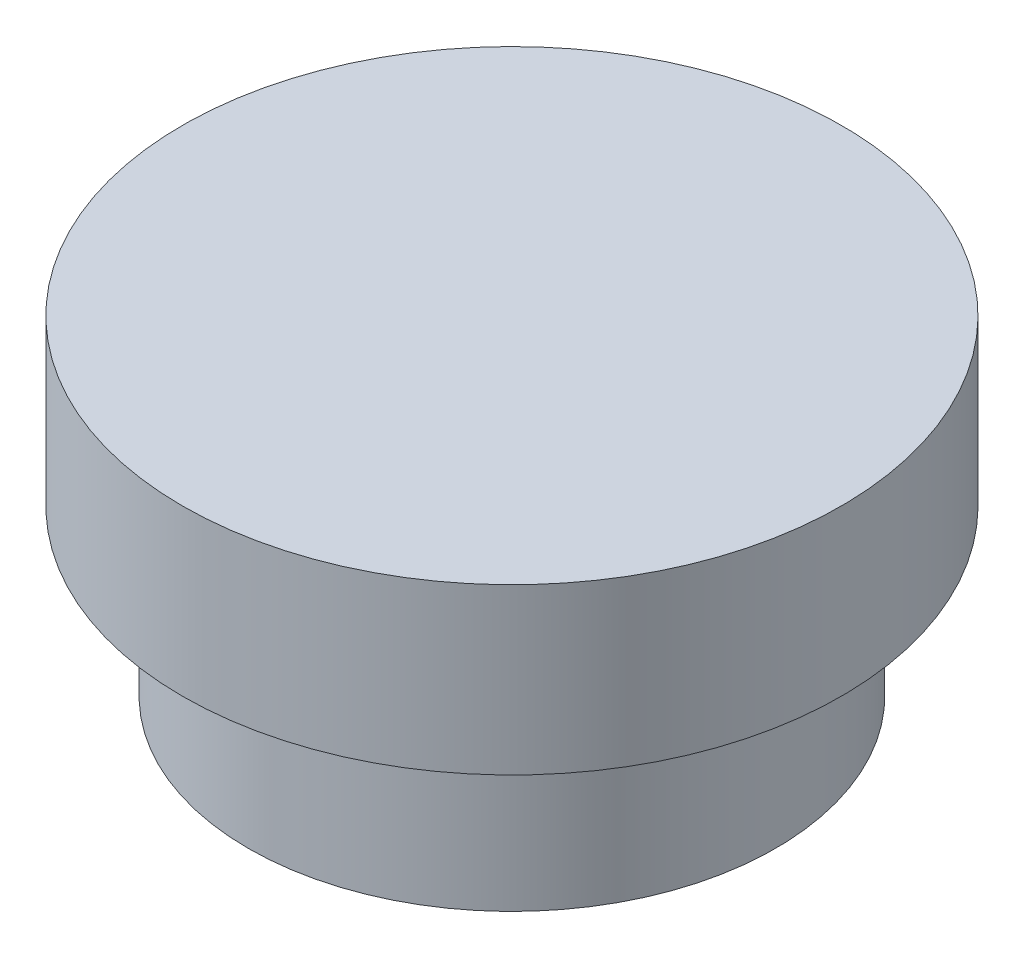
ISO-10303-21;
HEADER;
FILE_DESCRIPTION(('STEP AP214'),'2;1');
FILE_NAME('part.step','',(''),(''),'','','');
FILE_SCHEMA(('AUTOMOTIVE_DESIGN { 1 0 10303 214 1 1 1 1 }'));
ENDSEC;
DATA;
#1=APPLICATION_CONTEXT('core data for automotive mechanical design processes');
#2=APPLICATION_PROTOCOL_DEFINITION('international standard','automotive_design',2000,#1);
#3=PRODUCT_CONTEXT('',#1,'mechanical');
#4=PRODUCT('Part','Part','',(#3));
#5=PRODUCT_RELATED_PRODUCT_CATEGORY('part','',(#4));
#6=PRODUCT_DEFINITION_FORMATION('','',#4);
#7=PRODUCT_DEFINITION_CONTEXT('part definition',#1,'design');
#8=PRODUCT_DEFINITION('design','',#6,#7);
#9=PRODUCT_DEFINITION_SHAPE('','',#8);
#10=(LENGTH_UNIT() NAMED_UNIT(*) SI_UNIT(.MILLI.,.METRE.));
#11=(NAMED_UNIT(*) PLANE_ANGLE_UNIT() SI_UNIT($,.RADIAN.));
#12=(NAMED_UNIT(*) SI_UNIT($,.STERADIAN.) SOLID_ANGLE_UNIT());
#13=UNCERTAINTY_MEASURE_WITH_UNIT(LENGTH_MEASURE(1.E-05),#10,'distance_accuracy_value','');
#14=(GEOMETRIC_REPRESENTATION_CONTEXT(3) GLOBAL_UNCERTAINTY_ASSIGNED_CONTEXT((#13)) GLOBAL_UNIT_ASSIGNED_CONTEXT((#10,
#11,#12)) REPRESENTATION_CONTEXT('',''));
#15=CARTESIAN_POINT('',(0.,0.,0.));
#16=DIRECTION('',(0.,0.,1.));
#17=DIRECTION('',(1.,0.,0.));
#18=AXIS2_PLACEMENT_3D('',#15,#16,#17);
#19=CARTESIAN_POINT('',(0.,0.,0.));
#20=DIRECTION('',(0.,1.,0.));
#21=DIRECTION('',(0.,0.,1.));
#22=AXIS2_PLACEMENT_3D('',#19,#20,#21);
#23=PLANE('',#22);
#24=CARTESIAN_POINT('',(0.,0.,0.));
#25=DIRECTION('',(0.,1.,0.));
#26=DIRECTION('',(0.,0.,1.));
#27=AXIS2_PLACEMENT_3D('',#24,#25,#26);
#28=CIRCLE('',#27,10.);
#29=CARTESIAN_POINT('',(0.,0.,10.));
#30=VERTEX_POINT('',#29);
#31=EDGE_CURVE('E10',#30,#30,#28,.T.);
#32=ORIENTED_EDGE('',*,*,#31,.T.);
#33=EDGE_LOOP('',(#32));
#34=FACE_BOUND('',#33,.T.);
#35=ADVANCED_FACE('F30',(#34),#23,.T.);
#36=CARTESIAN_POINT('',(0.,16.3753522515049,0.));
#37=DIRECTION('',(0.,1.,0.));
#38=DIRECTION('',(0.,0.,1.));
#39=AXIS2_PLACEMENT_3D('',#36,#37,#38);
#40=CYLINDRICAL_SURFACE('',#39,10.);
#41=CARTESIAN_POINT('',(0.,-5.,0.));
#42=DIRECTION('',(0.,1.,0.));
#43=DIRECTION('',(0.,0.,1.));
#44=AXIS2_PLACEMENT_3D('',#41,#42,#43);
#45=CIRCLE('',#44,10.);
#46=CARTESIAN_POINT('',(0.,-5.,10.));
#47=VERTEX_POINT('',#46);
#48=EDGE_CURVE('E36',#47,#47,#45,.T.);
#49=ORIENTED_EDGE('',*,*,#48,.T.);
#50=EDGE_LOOP('',(#49));
#51=FACE_BOUND('',#50,.T.);
#52=ORIENTED_EDGE('',*,*,#31,.F.);
#53=EDGE_LOOP('',(#52));
#54=FACE_BOUND('',#53,.T.);
#55=ADVANCED_FACE('F62',(#51,#54),#40,.T.);
#56=CARTESIAN_POINT('',(-10.,-5.,0.));
#57=DIRECTION('',(0.,-1.,0.));
#58=DIRECTION('',(0.,0.,-1.));
#59=AXIS2_PLACEMENT_3D('',#56,#57,#58);
#60=PLANE('',#59);
#61=CARTESIAN_POINT('',(0.,-5.,0.));
#62=DIRECTION('',(0.,1.,0.));
#63=DIRECTION('',(0.,0.,1.));
#64=AXIS2_PLACEMENT_3D('',#61,#62,#63);
#65=CIRCLE('',#64,7.99999999999999);
#66=CARTESIAN_POINT('',(0.,-5.,7.99999999999999));
#67=VERTEX_POINT('',#66);
#68=EDGE_CURVE('E40',#67,#67,#65,.T.);
#69=ORIENTED_EDGE('',*,*,#68,.T.);
#70=EDGE_LOOP('',(#69));
#71=FACE_BOUND('',#70,.T.);
#72=ORIENTED_EDGE('',*,*,#48,.F.);
#73=EDGE_LOOP('',(#72));
#74=FACE_BOUND('',#73,.T.);
#75=ADVANCED_FACE('F59',(#71,#74),#60,.T.);
#76=CARTESIAN_POINT('',(0.,16.3753522515049,0.));
#77=DIRECTION('',(0.,1.,0.));
#78=DIRECTION('',(0.,0.,1.));
#79=AXIS2_PLACEMENT_3D('',#76,#77,#78);
#80=CYLINDRICAL_SURFACE('',#79,7.99999999999999);
#81=CARTESIAN_POINT('',(0.,-10.,0.));
#82=DIRECTION('',(0.,1.,0.));
#83=DIRECTION('',(0.,0.,1.));
#84=AXIS2_PLACEMENT_3D('',#81,#82,#83);
#85=CIRCLE('',#84,7.99999999999999);
#86=CARTESIAN_POINT('',(0.,-10.,7.99999999999999));
#87=VERTEX_POINT('',#86);
#88=EDGE_CURVE('E44',#87,#87,#85,.T.);
#89=ORIENTED_EDGE('',*,*,#88,.T.);
#90=EDGE_LOOP('',(#89));
#91=FACE_BOUND('',#90,.T.);
#92=ORIENTED_EDGE('',*,*,#68,.F.);
#93=EDGE_LOOP('',(#92));
#94=FACE_BOUND('',#93,.T.);
#95=ADVANCED_FACE('F50',(#91,#94),#80,.T.);
#96=CARTESIAN_POINT('',(-7.99999999999999,-10.,0.));
#97=DIRECTION('',(0.,-1.,0.));
#98=DIRECTION('',(0.,0.,-1.));
#99=AXIS2_PLACEMENT_3D('',#96,#97,#98);
#100=PLANE('',#99);
#101=ORIENTED_EDGE('',*,*,#88,.F.);
#102=EDGE_LOOP('',(#101));
#103=FACE_BOUND('',#102,.T.);
#104=ADVANCED_FACE('F53',(#103),#100,.T.);
#105=CLOSED_SHELL('',(#35,#55,#75,#95,#104));
#106=MANIFOLD_SOLID_BREP('B2',#105);
#107=ADVANCED_BREP_SHAPE_REPRESENTATION('',(#18,#106),#14);
#108=SHAPE_DEFINITION_REPRESENTATION(#9,#107);
ENDSEC;
END-ISO-10303-21;
